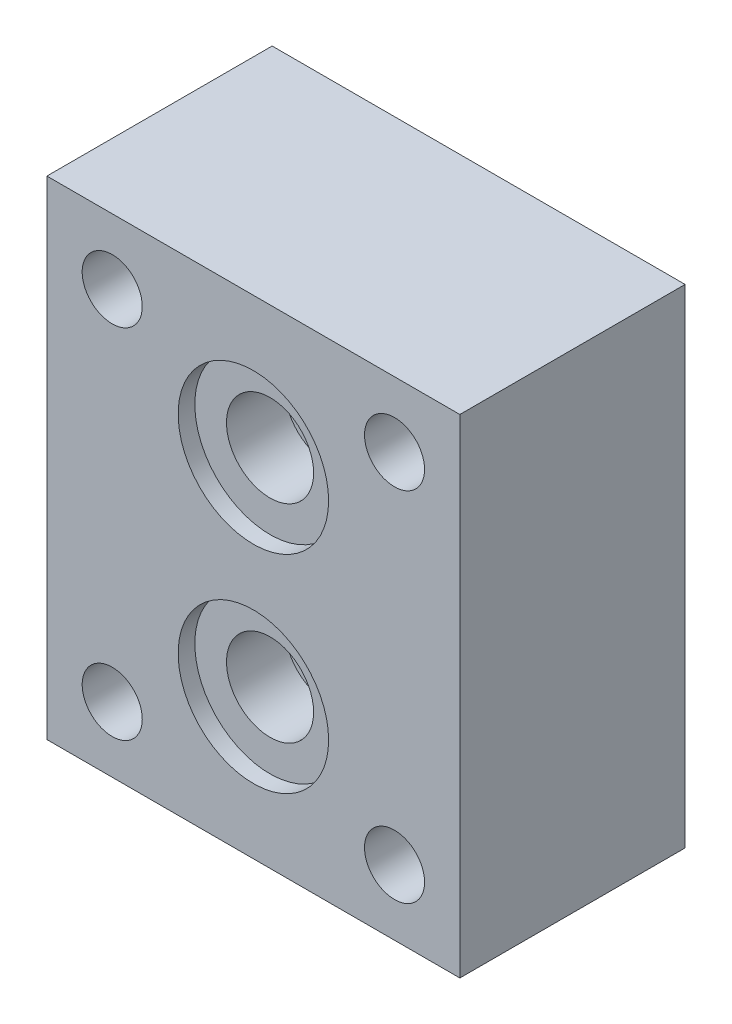
ISO-10303-21;
HEADER;
FILE_DESCRIPTION(('STEP AP214'),'2;1');
FILE_NAME('part.step','',(''),(''),'','','');
FILE_SCHEMA(('AUTOMOTIVE_DESIGN { 1 0 10303 214 1 1 1 1 }'));
ENDSEC;
DATA;
#1=APPLICATION_CONTEXT('core data for automotive mechanical design processes');
#2=APPLICATION_PROTOCOL_DEFINITION('international standard','automotive_design',2000,#1);
#3=PRODUCT_CONTEXT('',#1,'mechanical');
#4=PRODUCT('Part','Part','',(#3));
#5=PRODUCT_RELATED_PRODUCT_CATEGORY('part','',(#4));
#6=PRODUCT_DEFINITION_FORMATION('','',#4);
#7=PRODUCT_DEFINITION_CONTEXT('part definition',#1,'design');
#8=PRODUCT_DEFINITION('design','',#6,#7);
#9=PRODUCT_DEFINITION_SHAPE('','',#8);
#10=(LENGTH_UNIT() NAMED_UNIT(*) SI_UNIT(.MILLI.,.METRE.));
#11=(NAMED_UNIT(*) PLANE_ANGLE_UNIT() SI_UNIT($,.RADIAN.));
#12=(NAMED_UNIT(*) SI_UNIT($,.STERADIAN.) SOLID_ANGLE_UNIT());
#13=UNCERTAINTY_MEASURE_WITH_UNIT(LENGTH_MEASURE(1.E-05),#10,'distance_accuracy_value','');
#14=(GEOMETRIC_REPRESENTATION_CONTEXT(3) GLOBAL_UNCERTAINTY_ASSIGNED_CONTEXT((#13)) GLOBAL_UNIT_ASSIGNED_CONTEXT((#10,
#11,#12)) REPRESENTATION_CONTEXT('',''));
#15=CARTESIAN_POINT('',(0.,0.,0.));
#16=DIRECTION('',(0.,0.,1.));
#17=DIRECTION('',(1.,0.,0.));
#18=AXIS2_PLACEMENT_3D('',#15,#16,#17);
#19=CARTESIAN_POINT('',(34.925,41.275,19.05));
#20=DIRECTION('',(0.,-1.,0.));
#21=DIRECTION('',(0.,0.,-1.));
#22=AXIS2_PLACEMENT_3D('',#19,#20,#21);
#23=PLANE('',#22);
#24=DIRECTION('',(-1.,0.,0.));
#25=VECTOR('',#24,1.);
#26=CARTESIAN_POINT('',(34.925,41.275,-19.05));
#27=LINE('',#26,#25);
#28=CARTESIAN_POINT('',(34.925,41.275,-19.05));
#29=VERTEX_POINT('',#28);
#30=CARTESIAN_POINT('',(-34.925,41.275,-19.05));
#31=VERTEX_POINT('',#30);
#32=EDGE_CURVE('E109',#29,#31,#27,.T.);
#33=ORIENTED_EDGE('',*,*,#32,.T.);
#34=DIRECTION('',(0.,0.,-1.));
#35=VECTOR('',#34,1.);
#36=CARTESIAN_POINT('',(-34.925,41.275,19.05));
#37=LINE('',#36,#35);
#38=CARTESIAN_POINT('',(-34.925,41.275,19.05));
#39=VERTEX_POINT('',#38);
#40=EDGE_CURVE('E11',#39,#31,#37,.T.);
#41=ORIENTED_EDGE('',*,*,#40,.F.);
#42=DIRECTION('',(-1.,0.,0.));
#43=VECTOR('',#42,1.);
#44=CARTESIAN_POINT('',(34.925,41.275,19.05));
#45=LINE('',#44,#43);
#46=CARTESIAN_POINT('',(34.925,41.275,19.05));
#47=VERTEX_POINT('',#46);
#48=EDGE_CURVE('E96',#47,#39,#45,.T.);
#49=ORIENTED_EDGE('',*,*,#48,.F.);
#50=DIRECTION('',(0.,0.,-1.));
#51=VECTOR('',#50,1.);
#52=CARTESIAN_POINT('',(34.925,41.275,19.05));
#53=LINE('',#52,#51);
#54=EDGE_CURVE('E105',#47,#29,#53,.T.);
#55=ORIENTED_EDGE('',*,*,#54,.T.);
#56=EDGE_LOOP('',(#33,#41,#49,#55));
#57=FACE_BOUND('',#56,.T.);
#58=ADVANCED_FACE('F43',(#57),#23,.F.);
#59=CARTESIAN_POINT('',(-34.925,-41.275,19.05));
#60=DIRECTION('',(1.,0.,0.));
#61=DIRECTION('',(0.,0.,-1.));
#62=AXIS2_PLACEMENT_3D('',#59,#60,#61);
#63=PLANE('',#62);
#64=DIRECTION('',(0.,-1.,0.));
#65=VECTOR('',#64,1.);
#66=CARTESIAN_POINT('',(-34.925,-41.275,-19.05));
#67=LINE('',#66,#65);
#68=CARTESIAN_POINT('',(-34.925,-41.275,-19.05));
#69=VERTEX_POINT('',#68);
#70=EDGE_CURVE('E100',#31,#69,#67,.T.);
#71=ORIENTED_EDGE('',*,*,#70,.T.);
#72=DIRECTION('',(0.,0.,-1.));
#73=VECTOR('',#72,1.);
#74=CARTESIAN_POINT('',(-34.925,-41.275,19.05));
#75=LINE('',#74,#73);
#76=CARTESIAN_POINT('',(-34.925,-41.275,19.05));
#77=VERTEX_POINT('',#76);
#78=EDGE_CURVE('E52',#77,#69,#75,.T.);
#79=ORIENTED_EDGE('',*,*,#78,.F.);
#80=DIRECTION('',(0.,-1.,0.));
#81=VECTOR('',#80,1.);
#82=CARTESIAN_POINT('',(-34.925,-41.275,19.05));
#83=LINE('',#82,#81);
#84=EDGE_CURVE('E91',#39,#77,#83,.T.);
#85=ORIENTED_EDGE('',*,*,#84,.F.);
#86=ORIENTED_EDGE('',*,*,#40,.T.);
#87=EDGE_LOOP('',(#71,#79,#85,#86));
#88=FACE_BOUND('',#87,.T.);
#89=ADVANCED_FACE('F99',(#88),#63,.F.);
#90=CARTESIAN_POINT('',(34.925,-41.275,19.05));
#91=DIRECTION('',(0.,1.,0.));
#92=DIRECTION('',(0.,0.,1.));
#93=AXIS2_PLACEMENT_3D('',#90,#91,#92);
#94=PLANE('',#93);
#95=DIRECTION('',(1.,0.,0.));
#96=VECTOR('',#95,1.);
#97=CARTESIAN_POINT('',(34.925,-41.275,-19.05));
#98=LINE('',#97,#96);
#99=CARTESIAN_POINT('',(34.925,-41.275,-19.05));
#100=VERTEX_POINT('',#99);
#101=EDGE_CURVE('E78',#69,#100,#98,.T.);
#102=ORIENTED_EDGE('',*,*,#101,.T.);
#103=DIRECTION('',(0.,0.,-1.));
#104=VECTOR('',#103,1.);
#105=CARTESIAN_POINT('',(34.925,-41.275,19.05));
#106=LINE('',#105,#104);
#107=CARTESIAN_POINT('',(34.925,-41.275,19.05));
#108=VERTEX_POINT('',#107);
#109=EDGE_CURVE('E101',#108,#100,#106,.T.);
#110=ORIENTED_EDGE('',*,*,#109,.F.);
#111=DIRECTION('',(1.,0.,0.));
#112=VECTOR('',#111,1.);
#113=CARTESIAN_POINT('',(34.925,-41.275,19.05));
#114=LINE('',#113,#112);
#115=EDGE_CURVE('E94',#77,#108,#114,.T.);
#116=ORIENTED_EDGE('',*,*,#115,.F.);
#117=ORIENTED_EDGE('',*,*,#78,.T.);
#118=EDGE_LOOP('',(#102,#110,#116,#117));
#119=FACE_BOUND('',#118,.T.);
#120=ADVANCED_FACE('F103',(#119),#94,.F.);
#121=CARTESIAN_POINT('',(34.925,-41.275,19.05));
#122=DIRECTION('',(-1.,0.,0.));
#123=DIRECTION('',(0.,0.,1.));
#124=AXIS2_PLACEMENT_3D('',#121,#122,#123);
#125=PLANE('',#124);
#126=DIRECTION('',(0.,1.,0.));
#127=VECTOR('',#126,1.);
#128=CARTESIAN_POINT('',(34.925,-41.275,-19.05));
#129=LINE('',#128,#127);
#130=EDGE_CURVE('E84',#100,#29,#129,.T.);
#131=ORIENTED_EDGE('',*,*,#130,.T.);
#132=ORIENTED_EDGE('',*,*,#54,.F.);
#133=DIRECTION('',(0.,1.,0.));
#134=VECTOR('',#133,1.);
#135=CARTESIAN_POINT('',(34.925,-41.275,19.05));
#136=LINE('',#135,#134);
#137=EDGE_CURVE('E61',#108,#47,#136,.T.);
#138=ORIENTED_EDGE('',*,*,#137,.F.);
#139=ORIENTED_EDGE('',*,*,#109,.T.);
#140=EDGE_LOOP('',(#131,#132,#138,#139));
#141=FACE_BOUND('',#140,.T.);
#142=ADVANCED_FACE('F171',(#141),#125,.F.);
#143=CARTESIAN_POINT('',(0.,0.,19.05));
#144=DIRECTION('',(0.,0.,-1.));
#145=DIRECTION('',(-1.,0.,0.));
#146=AXIS2_PLACEMENT_3D('',#143,#144,#145);
#147=PLANE('',#146);
#148=CARTESIAN_POINT('',(0.,17.526,19.05));
#149=DIRECTION('',(0.,0.,1.));
#150=DIRECTION('',(1.,0.,0.));
#151=AXIS2_PLACEMENT_3D('',#148,#149,#150);
#152=CIRCLE('',#151,12.7254);
#153=CARTESIAN_POINT('',(12.7254,17.526,19.05));
#154=VERTEX_POINT('',#153);
#155=EDGE_CURVE('E318',#154,#154,#152,.T.);
#156=ORIENTED_EDGE('',*,*,#155,.F.);
#157=EDGE_LOOP('',(#156));
#158=FACE_BOUND('',#157,.T.);
#159=CARTESIAN_POINT('',(0.,-17.526,19.05));
#160=DIRECTION('',(0.,0.,1.));
#161=DIRECTION('',(1.,0.,0.));
#162=AXIS2_PLACEMENT_3D('',#159,#160,#161);
#163=CIRCLE('',#162,12.7254);
#164=CARTESIAN_POINT('',(12.7254,-17.526,19.05));
#165=VERTEX_POINT('',#164);
#166=EDGE_CURVE('E127',#165,#165,#163,.T.);
#167=ORIENTED_EDGE('',*,*,#166,.F.);
#168=EDGE_LOOP('',(#167));
#169=FACE_BOUND('',#168,.T.);
#170=CARTESIAN_POINT('',(23.876,30.226,19.05));
#171=DIRECTION('',(0.,0.,1.));
#172=DIRECTION('',(1.,0.,0.));
#173=AXIS2_PLACEMENT_3D('',#170,#171,#172);
#174=CIRCLE('',#173,5.08);
#175=CARTESIAN_POINT('',(28.956,30.226,19.05));
#176=VERTEX_POINT('',#175);
#177=EDGE_CURVE('E137',#176,#176,#174,.T.);
#178=ORIENTED_EDGE('',*,*,#177,.F.);
#179=EDGE_LOOP('',(#178));
#180=FACE_BOUND('',#179,.T.);
#181=CARTESIAN_POINT('',(-23.876,-30.226,19.05));
#182=DIRECTION('',(0.,0.,1.));
#183=DIRECTION('',(1.,0.,0.));
#184=AXIS2_PLACEMENT_3D('',#181,#182,#183);
#185=CIRCLE('',#184,5.08);
#186=CARTESIAN_POINT('',(-18.796,-30.226,19.05));
#187=VERTEX_POINT('',#186);
#188=EDGE_CURVE('E147',#187,#187,#185,.T.);
#189=ORIENTED_EDGE('',*,*,#188,.F.);
#190=EDGE_LOOP('',(#189));
#191=FACE_BOUND('',#190,.T.);
#192=CARTESIAN_POINT('',(-23.876,30.226,19.05));
#193=DIRECTION('',(0.,0.,1.));
#194=DIRECTION('',(1.,0.,0.));
#195=AXIS2_PLACEMENT_3D('',#192,#193,#194);
#196=CIRCLE('',#195,5.08);
#197=CARTESIAN_POINT('',(-18.796,30.226,19.05));
#198=VERTEX_POINT('',#197);
#199=EDGE_CURVE('E124',#198,#198,#196,.T.);
#200=ORIENTED_EDGE('',*,*,#199,.F.);
#201=EDGE_LOOP('',(#200));
#202=FACE_BOUND('',#201,.T.);
#203=CARTESIAN_POINT('',(23.876,-30.226,19.05));
#204=DIRECTION('',(0.,0.,1.));
#205=DIRECTION('',(1.,0.,0.));
#206=AXIS2_PLACEMENT_3D('',#203,#204,#205);
#207=CIRCLE('',#206,5.08);
#208=CARTESIAN_POINT('',(28.956,-30.226,19.05));
#209=VERTEX_POINT('',#208);
#210=EDGE_CURVE('E112',#209,#209,#207,.T.);
#211=ORIENTED_EDGE('',*,*,#210,.F.);
#212=EDGE_LOOP('',(#211));
#213=FACE_BOUND('',#212,.T.);
#214=ORIENTED_EDGE('',*,*,#48,.T.);
#215=ORIENTED_EDGE('',*,*,#84,.T.);
#216=ORIENTED_EDGE('',*,*,#115,.T.);
#217=ORIENTED_EDGE('',*,*,#137,.T.);
#218=EDGE_LOOP('',(#214,#215,#216,#217));
#219=FACE_BOUND('',#218,.T.);
#220=ADVANCED_FACE('F92',(#158,#169,#180,#191,#202,#213,#219),#147,.F.);
#221=CARTESIAN_POINT('',(0.,0.,-19.05));
#222=DIRECTION('',(0.,0.,-1.));
#223=DIRECTION('',(-1.,0.,0.));
#224=AXIS2_PLACEMENT_3D('',#221,#222,#223);
#225=PLANE('',#224);
#226=CARTESIAN_POINT('',(23.876,30.226,-19.05));
#227=DIRECTION('',(0.,0.,-1.));
#228=DIRECTION('',(-1.,0.,0.));
#229=AXIS2_PLACEMENT_3D('',#226,#227,#228);
#230=CIRCLE('',#229,5.08);
#231=CARTESIAN_POINT('',(18.796,30.226,-19.05));
#232=VERTEX_POINT('',#231);
#233=EDGE_CURVE('E141',#232,#232,#230,.F.);
#234=ORIENTED_EDGE('',*,*,#233,.T.);
#235=EDGE_LOOP('',(#234));
#236=FACE_BOUND('',#235,.T.);
#237=CARTESIAN_POINT('',(-23.876,-30.226,-19.05));
#238=DIRECTION('',(0.,0.,-1.));
#239=DIRECTION('',(-1.,0.,0.));
#240=AXIS2_PLACEMENT_3D('',#237,#238,#239);
#241=CIRCLE('',#240,5.08);
#242=CARTESIAN_POINT('',(-28.956,-30.226,-19.05));
#243=VERTEX_POINT('',#242);
#244=EDGE_CURVE('E144',#243,#243,#241,.F.);
#245=ORIENTED_EDGE('',*,*,#244,.T.);
#246=EDGE_LOOP('',(#245));
#247=FACE_BOUND('',#246,.T.);
#248=CARTESIAN_POINT('',(-23.876,30.226,-19.05));
#249=DIRECTION('',(0.,0.,-1.));
#250=DIRECTION('',(-1.,0.,0.));
#251=AXIS2_PLACEMENT_3D('',#248,#249,#250);
#252=CIRCLE('',#251,5.08);
#253=CARTESIAN_POINT('',(-28.956,30.226,-19.05));
#254=VERTEX_POINT('',#253);
#255=EDGE_CURVE('E150',#254,#254,#252,.F.);
#256=ORIENTED_EDGE('',*,*,#255,.T.);
#257=EDGE_LOOP('',(#256));
#258=FACE_BOUND('',#257,.T.);
#259=CARTESIAN_POINT('',(23.876,-30.226,-19.05));
#260=DIRECTION('',(0.,0.,-1.));
#261=DIRECTION('',(-1.,0.,0.));
#262=AXIS2_PLACEMENT_3D('',#259,#260,#261);
#263=CIRCLE('',#262,5.08);
#264=CARTESIAN_POINT('',(18.796,-30.226,-19.05));
#265=VERTEX_POINT('',#264);
#266=EDGE_CURVE('E140',#265,#265,#263,.F.);
#267=ORIENTED_EDGE('',*,*,#266,.T.);
#268=EDGE_LOOP('',(#267));
#269=FACE_BOUND('',#268,.T.);
#270=ORIENTED_EDGE('',*,*,#32,.F.);
#271=ORIENTED_EDGE('',*,*,#130,.F.);
#272=ORIENTED_EDGE('',*,*,#101,.F.);
#273=ORIENTED_EDGE('',*,*,#70,.F.);
#274=EDGE_LOOP('',(#270,#271,#272,#273));
#275=FACE_BOUND('',#274,.T.);
#276=ADVANCED_FACE('F160',(#236,#247,#258,#269,#275),#225,.T.);
#277=CARTESIAN_POINT('',(23.876,-30.226,-19.051));
#278=DIRECTION('',(0.,0.,1.));
#279=DIRECTION('',(1.,0.,0.));
#280=AXIS2_PLACEMENT_3D('',#277,#278,#279);
#281=CYLINDRICAL_SURFACE('',#280,5.08);
#282=ORIENTED_EDGE('',*,*,#266,.F.);
#283=EDGE_LOOP('',(#282));
#284=FACE_BOUND('',#283,.T.);
#285=ORIENTED_EDGE('',*,*,#210,.T.);
#286=EDGE_LOOP('',(#285));
#287=FACE_BOUND('',#286,.T.);
#288=ADVANCED_FACE('F163',(#284,#287),#281,.F.);
#289=CARTESIAN_POINT('',(-23.876,30.226,-19.051));
#290=DIRECTION('',(0.,0.,1.));
#291=DIRECTION('',(1.,0.,0.));
#292=AXIS2_PLACEMENT_3D('',#289,#290,#291);
#293=CYLINDRICAL_SURFACE('',#292,5.08);
#294=ORIENTED_EDGE('',*,*,#255,.F.);
#295=EDGE_LOOP('',(#294));
#296=FACE_BOUND('',#295,.T.);
#297=ORIENTED_EDGE('',*,*,#199,.T.);
#298=EDGE_LOOP('',(#297));
#299=FACE_BOUND('',#298,.T.);
#300=ADVANCED_FACE('F166',(#296,#299),#293,.F.);
#301=CARTESIAN_POINT('',(-23.876,-30.226,-19.051));
#302=DIRECTION('',(0.,0.,1.));
#303=DIRECTION('',(1.,0.,0.));
#304=AXIS2_PLACEMENT_3D('',#301,#302,#303);
#305=CYLINDRICAL_SURFACE('',#304,5.08);
#306=ORIENTED_EDGE('',*,*,#244,.F.);
#307=EDGE_LOOP('',(#306));
#308=FACE_BOUND('',#307,.T.);
#309=ORIENTED_EDGE('',*,*,#188,.T.);
#310=EDGE_LOOP('',(#309));
#311=FACE_BOUND('',#310,.T.);
#312=ADVANCED_FACE('F219',(#308,#311),#305,.F.);
#313=CARTESIAN_POINT('',(23.876,30.226,-19.051));
#314=DIRECTION('',(0.,0.,1.));
#315=DIRECTION('',(1.,0.,0.));
#316=AXIS2_PLACEMENT_3D('',#313,#314,#315);
#317=CYLINDRICAL_SURFACE('',#316,5.08);
#318=ORIENTED_EDGE('',*,*,#233,.F.);
#319=EDGE_LOOP('',(#318));
#320=FACE_BOUND('',#319,.T.);
#321=ORIENTED_EDGE('',*,*,#177,.T.);
#322=EDGE_LOOP('',(#321));
#323=FACE_BOUND('',#322,.T.);
#324=ADVANCED_FACE('F228',(#320,#323),#317,.F.);
#325=CARTESIAN_POINT('',(0.,-17.526,16.2306));
#326=DIRECTION('',(0.,0.,1.));
#327=DIRECTION('',(1.,0.,0.));
#328=AXIS2_PLACEMENT_3D('',#325,#326,#327);
#329=PLANE('',#328);
#330=CARTESIAN_POINT('',(0.,-17.526,16.2306));
#331=DIRECTION('',(0.,0.,1.));
#332=DIRECTION('',(1.,0.,0.));
#333=AXIS2_PLACEMENT_3D('',#330,#331,#332);
#334=CIRCLE('',#333,12.7254);
#335=CARTESIAN_POINT('',(12.7254,-17.526,16.2306));
#336=VERTEX_POINT('',#335);
#337=EDGE_CURVE('E120',#336,#336,#334,.T.);
#338=ORIENTED_EDGE('',*,*,#337,.T.);
#339=EDGE_LOOP('',(#338));
#340=FACE_BOUND('',#339,.T.);
#341=CARTESIAN_POINT('',(0.,-17.526,16.2306));
#342=DIRECTION('',(0.,0.,1.));
#343=DIRECTION('',(1.,0.,0.));
#344=AXIS2_PLACEMENT_3D('',#341,#342,#343);
#345=CIRCLE('',#344,7.366);
#346=CARTESIAN_POINT('',(7.366,-17.526,16.2306));
#347=VERTEX_POINT('',#346);
#348=EDGE_CURVE('E117',#347,#347,#345,.F.);
#349=ORIENTED_EDGE('',*,*,#348,.T.);
#350=EDGE_LOOP('',(#349));
#351=FACE_BOUND('',#350,.T.);
#352=ADVANCED_FACE('F237',(#340,#351),#329,.T.);
#353=CARTESIAN_POINT('',(0.,-17.526,16.2306));
#354=DIRECTION('',(0.,0.,1.));
#355=DIRECTION('',(1.,0.,0.));
#356=AXIS2_PLACEMENT_3D('',#353,#354,#355);
#357=CYLINDRICAL_SURFACE('',#356,12.7254);
#358=ORIENTED_EDGE('',*,*,#337,.F.);
#359=EDGE_LOOP('',(#358));
#360=FACE_BOUND('',#359,.T.);
#361=ORIENTED_EDGE('',*,*,#166,.T.);
#362=EDGE_LOOP('',(#361));
#363=FACE_BOUND('',#362,.T.);
#364=ADVANCED_FACE('F248',(#360,#363),#357,.F.);
#365=CARTESIAN_POINT('',(0.,-17.526,6.35));
#366=DIRECTION('',(0.,0.,1.));
#367=DIRECTION('',(1.,0.,0.));
#368=AXIS2_PLACEMENT_3D('',#365,#366,#367);
#369=PLANE('',#368);
#370=CARTESIAN_POINT('',(0.,-17.526,6.35));
#371=DIRECTION('',(0.,0.,1.));
#372=DIRECTION('',(1.,0.,0.));
#373=AXIS2_PLACEMENT_3D('',#370,#371,#372);
#374=CIRCLE('',#373,7.366);
#375=CARTESIAN_POINT('',(7.366,-17.526,6.35));
#376=VERTEX_POINT('',#375);
#377=EDGE_CURVE('E119',#376,#376,#374,.T.);
#378=ORIENTED_EDGE('',*,*,#377,.T.);
#379=EDGE_LOOP('',(#378));
#380=FACE_BOUND('',#379,.T.);
#381=ADVANCED_FACE('F244',(#380),#369,.T.);
#382=CARTESIAN_POINT('',(0.,-17.526,6.35));
#383=DIRECTION('',(0.,0.,1.));
#384=DIRECTION('',(1.,0.,0.));
#385=AXIS2_PLACEMENT_3D('',#382,#383,#384);
#386=CYLINDRICAL_SURFACE('',#385,7.366);
#387=ORIENTED_EDGE('',*,*,#377,.F.);
#388=EDGE_LOOP('',(#387));
#389=FACE_BOUND('',#388,.T.);
#390=ORIENTED_EDGE('',*,*,#348,.F.);
#391=EDGE_LOOP('',(#390));
#392=FACE_BOUND('',#391,.T.);
#393=ADVANCED_FACE('F247',(#389,#392),#386,.F.);
#394=CARTESIAN_POINT('',(0.,17.526,16.2306));
#395=DIRECTION('',(0.,0.,1.));
#396=DIRECTION('',(1.,0.,0.));
#397=AXIS2_PLACEMENT_3D('',#394,#395,#396);
#398=PLANE('',#397);
#399=CARTESIAN_POINT('',(0.,17.526,16.2306));
#400=DIRECTION('',(0.,0.,1.));
#401=DIRECTION('',(1.,0.,0.));
#402=AXIS2_PLACEMENT_3D('',#399,#400,#401);
#403=CIRCLE('',#402,12.7254);
#404=CARTESIAN_POINT('',(12.7254,17.526,16.2306));
#405=VERTEX_POINT('',#404);
#406=EDGE_CURVE('E316',#405,#405,#403,.T.);
#407=ORIENTED_EDGE('',*,*,#406,.T.);
#408=EDGE_LOOP('',(#407));
#409=FACE_BOUND('',#408,.T.);
#410=CARTESIAN_POINT('',(0.,17.526,16.2306));
#411=DIRECTION('',(0.,0.,1.));
#412=DIRECTION('',(1.,0.,0.));
#413=AXIS2_PLACEMENT_3D('',#410,#411,#412);
#414=CIRCLE('',#413,7.366);
#415=CARTESIAN_POINT('',(7.366,17.526,16.2306));
#416=VERTEX_POINT('',#415);
#417=EDGE_CURVE('E46',#416,#416,#414,.F.);
#418=ORIENTED_EDGE('',*,*,#417,.T.);
#419=EDGE_LOOP('',(#418));
#420=FACE_BOUND('',#419,.T.);
#421=ADVANCED_FACE('F273',(#409,#420),#398,.T.);
#422=CARTESIAN_POINT('',(0.,17.526,16.2306));
#423=DIRECTION('',(0.,0.,1.));
#424=DIRECTION('',(1.,0.,0.));
#425=AXIS2_PLACEMENT_3D('',#422,#423,#424);
#426=CYLINDRICAL_SURFACE('',#425,12.7254);
#427=ORIENTED_EDGE('',*,*,#406,.F.);
#428=EDGE_LOOP('',(#427));
#429=FACE_BOUND('',#428,.T.);
#430=ORIENTED_EDGE('',*,*,#155,.T.);
#431=EDGE_LOOP('',(#430));
#432=FACE_BOUND('',#431,.T.);
#433=ADVANCED_FACE('F280',(#429,#432),#426,.F.);
#434=CARTESIAN_POINT('',(0.,17.526,6.35));
#435=DIRECTION('',(0.,0.,1.));
#436=DIRECTION('',(1.,0.,0.));
#437=AXIS2_PLACEMENT_3D('',#434,#435,#436);
#438=PLANE('',#437);
#439=CARTESIAN_POINT('',(0.,17.526,6.35));
#440=DIRECTION('',(0.,0.,1.));
#441=DIRECTION('',(1.,0.,0.));
#442=AXIS2_PLACEMENT_3D('',#439,#440,#441);
#443=CIRCLE('',#442,7.366);
#444=CARTESIAN_POINT('',(7.366,17.526,6.35));
#445=VERTEX_POINT('',#444);
#446=EDGE_CURVE('E132',#445,#445,#443,.T.);
#447=ORIENTED_EDGE('',*,*,#446,.T.);
#448=EDGE_LOOP('',(#447));
#449=FACE_BOUND('',#448,.T.);
#450=ADVANCED_FACE('F277',(#449),#438,.T.);
#451=CARTESIAN_POINT('',(0.,17.526,6.35));
#452=DIRECTION('',(0.,0.,1.));
#453=DIRECTION('',(1.,0.,0.));
#454=AXIS2_PLACEMENT_3D('',#451,#452,#453);
#455=CYLINDRICAL_SURFACE('',#454,7.366);
#456=ORIENTED_EDGE('',*,*,#446,.F.);
#457=EDGE_LOOP('',(#456));
#458=FACE_BOUND('',#457,.T.);
#459=ORIENTED_EDGE('',*,*,#417,.F.);
#460=EDGE_LOOP('',(#459));
#461=FACE_BOUND('',#460,.T.);
#462=ADVANCED_FACE('F279',(#458,#461),#455,.F.);
#463=CLOSED_SHELL('',(#58,#89,#120,#142,#220,#276,#288,#300,#312,#324,#352,#364,#381,#393,#421,
#433,#450,#462));
#464=MANIFOLD_SOLID_BREP('B2',#463);
#465=ADVANCED_BREP_SHAPE_REPRESENTATION('',(#18,#464),#14);
#466=SHAPE_DEFINITION_REPRESENTATION(#9,#465);
ENDSEC;
END-ISO-10303-21;
